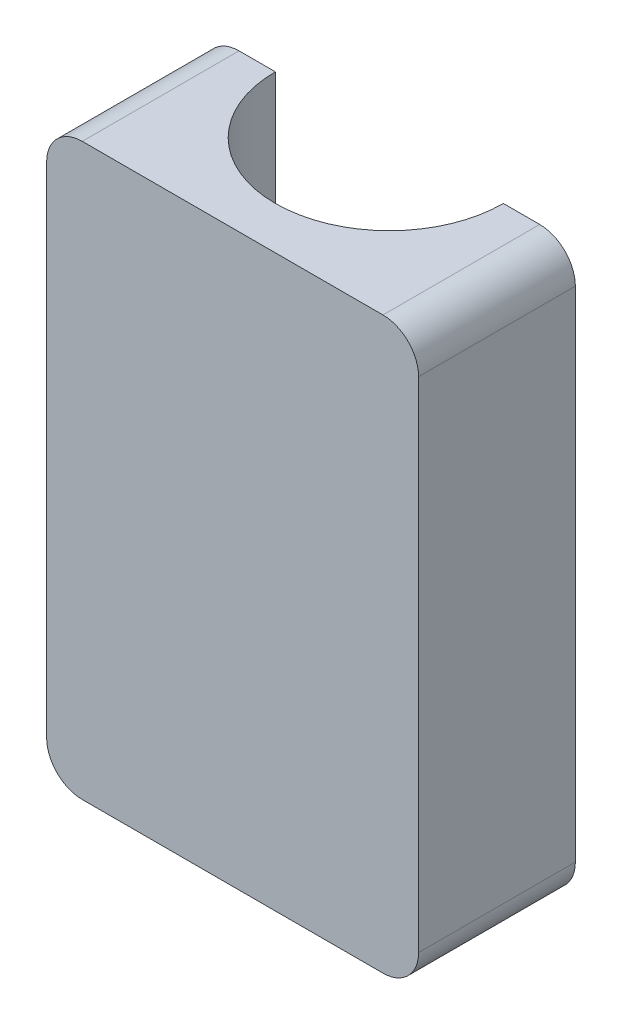
ISO-10303-21;
HEADER;
FILE_DESCRIPTION(('STEP AP214'),'2;1');
FILE_NAME('part.step','',(''),(''),'','','');
FILE_SCHEMA(('AUTOMOTIVE_DESIGN { 1 0 10303 214 1 1 1 1 }'));
ENDSEC;
DATA;
#1=APPLICATION_CONTEXT('core data for automotive mechanical design processes');
#2=APPLICATION_PROTOCOL_DEFINITION('international standard','automotive_design',2000,#1);
#3=PRODUCT_CONTEXT('',#1,'mechanical');
#4=PRODUCT('Part','Part','',(#3));
#5=PRODUCT_RELATED_PRODUCT_CATEGORY('part','',(#4));
#6=PRODUCT_DEFINITION_FORMATION('','',#4);
#7=PRODUCT_DEFINITION_CONTEXT('part definition',#1,'design');
#8=PRODUCT_DEFINITION('design','',#6,#7);
#9=PRODUCT_DEFINITION_SHAPE('','',#8);
#10=(LENGTH_UNIT() NAMED_UNIT(*) SI_UNIT(.MILLI.,.METRE.));
#11=(NAMED_UNIT(*) PLANE_ANGLE_UNIT() SI_UNIT($,.RADIAN.));
#12=(NAMED_UNIT(*) SI_UNIT($,.STERADIAN.) SOLID_ANGLE_UNIT());
#13=UNCERTAINTY_MEASURE_WITH_UNIT(LENGTH_MEASURE(1.E-05),#10,'distance_accuracy_value','');
#14=(GEOMETRIC_REPRESENTATION_CONTEXT(3) GLOBAL_UNCERTAINTY_ASSIGNED_CONTEXT((#13)) GLOBAL_UNIT_ASSIGNED_CONTEXT((#10,
#11,#12)) REPRESENTATION_CONTEXT('',''));
#15=CARTESIAN_POINT('',(0.,0.,0.));
#16=DIRECTION('',(0.,0.,1.));
#17=DIRECTION('',(1.,0.,0.));
#18=AXIS2_PLACEMENT_3D('',#15,#16,#17);
#19=CARTESIAN_POINT('',(0.,0.,0.));
#20=DIRECTION('',(0.,0.,1.));
#21=DIRECTION('',(1.,0.,0.));
#22=AXIS2_PLACEMENT_3D('',#19,#20,#21);
#23=PLANE('',#22);
#24=DIRECTION('',(-1.,0.,0.));
#25=VECTOR('',#24,1.);
#26=CARTESIAN_POINT('',(-41.2247953621848,-2.00646090534981,0.));
#27=LINE('',#26,#25);
#28=CARTESIAN_POINT('',(-31.1247953621848,-2.00646090534981,0.));
#29=VERTEX_POINT('',#28);
#30=CARTESIAN_POINT('',(-36.2247953621848,-2.00646090534981,0.));
#31=VERTEX_POINT('',#30);
#32=EDGE_CURVE('E144',#29,#31,#27,.T.);
#33=ORIENTED_EDGE('',*,*,#32,.F.);
#34=DIRECTION('',(0.,-1.,0.));
#35=VECTOR('',#34,1.);
#36=CARTESIAN_POINT('',(-31.1247953621848,-2.00646090534981,0.));
#37=LINE('',#36,#35);
#38=CARTESIAN_POINT('',(-31.1247953621848,-82.0064609053498,0.));
#39=VERTEX_POINT('',#38);
#40=EDGE_CURVE('E11',#29,#39,#37,.T.);
#41=ORIENTED_EDGE('',*,*,#40,.T.);
#42=DIRECTION('',(1.,0.,0.));
#43=VECTOR('',#42,1.);
#44=CARTESIAN_POINT('',(-41.2247953621848,-82.0064609053498,0.));
#45=LINE('',#44,#43);
#46=CARTESIAN_POINT('',(-36.2247953621848,-82.0064609053498,0.));
#47=VERTEX_POINT('',#46);
#48=EDGE_CURVE('E129',#47,#39,#45,.T.);
#49=ORIENTED_EDGE('',*,*,#48,.F.);
#50=CARTESIAN_POINT('',(-36.2247953621848,-77.0064609053498,0.));
#51=DIRECTION('',(0.,0.,1.));
#52=DIRECTION('',(1.,0.,0.));
#53=AXIS2_PLACEMENT_3D('',#50,#51,#52);
#54=CIRCLE('',#53,5.);
#55=CARTESIAN_POINT('',(-41.2247953621848,-77.0064609053498,0.));
#56=VERTEX_POINT('',#55);
#57=EDGE_CURVE('E159',#47,#56,#54,.F.);
#58=ORIENTED_EDGE('',*,*,#57,.T.);
#59=DIRECTION('',(0.,-1.,0.));
#60=VECTOR('',#59,1.);
#61=CARTESIAN_POINT('',(-41.2247953621848,-2.00646090534981,0.));
#62=LINE('',#61,#60);
#63=CARTESIAN_POINT('',(-41.2247953621848,-7.00646090534981,0.));
#64=VERTEX_POINT('',#63);
#65=EDGE_CURVE('E135',#64,#56,#62,.T.);
#66=ORIENTED_EDGE('',*,*,#65,.F.);
#67=CARTESIAN_POINT('',(-36.2247953621848,-7.00646090534981,0.));
#68=DIRECTION('',(0.,0.,1.));
#69=DIRECTION('',(1.,0.,0.));
#70=AXIS2_PLACEMENT_3D('',#67,#68,#69);
#71=CIRCLE('',#70,5.);
#72=EDGE_CURVE('E153',#64,#31,#71,.F.);
#73=ORIENTED_EDGE('',*,*,#72,.T.);
#74=EDGE_LOOP('',(#33,#41,#49,#58,#66,#73));
#75=FACE_BOUND('',#74,.T.);
#76=ADVANCED_FACE('F39',(#75),#23,.F.);
#77=CARTESIAN_POINT('',(-41.2247953621848,-2.00646090534981,22.));
#78=DIRECTION('',(1.,0.,0.));
#79=DIRECTION('',(0.,0.,-1.));
#80=AXIS2_PLACEMENT_3D('',#77,#78,#79);
#81=PLANE('',#80);
#82=ORIENTED_EDGE('',*,*,#65,.T.);
#83=DIRECTION('',(0.,0.,-1.));
#84=VECTOR('',#83,1.);
#85=CARTESIAN_POINT('',(-41.2247953621848,-77.0064609053498,22.));
#86=LINE('',#85,#84);
#87=CARTESIAN_POINT('',(-41.2247953621848,-77.0064609053498,22.));
#88=VERTEX_POINT('',#87);
#89=EDGE_CURVE('E164',#56,#88,#86,.F.);
#90=ORIENTED_EDGE('',*,*,#89,.T.);
#91=DIRECTION('',(0.,-1.,0.));
#92=VECTOR('',#91,1.);
#93=CARTESIAN_POINT('',(-41.2247953621848,-2.00646090534981,22.));
#94=LINE('',#93,#92);
#95=CARTESIAN_POINT('',(-41.2247953621848,-7.00646090534981,22.));
#96=VERTEX_POINT('',#95);
#97=EDGE_CURVE('E147',#96,#88,#94,.T.);
#98=ORIENTED_EDGE('',*,*,#97,.F.);
#99=DIRECTION('',(0.,0.,-1.));
#100=VECTOR('',#99,1.);
#101=CARTESIAN_POINT('',(-41.2247953621848,-7.00646090534981,22.));
#102=LINE('',#101,#100);
#103=EDGE_CURVE('E161',#96,#64,#102,.T.);
#104=ORIENTED_EDGE('',*,*,#103,.T.);
#105=EDGE_LOOP('',(#82,#90,#98,#104));
#106=FACE_BOUND('',#105,.T.);
#107=ADVANCED_FACE('F212',(#106),#81,.F.);
#108=CARTESIAN_POINT('',(-41.2247953621848,-82.0064609053498,22.));
#109=DIRECTION('',(0.,1.,0.));
#110=DIRECTION('',(0.,0.,1.));
#111=AXIS2_PLACEMENT_3D('',#108,#109,#110);
#112=PLANE('',#111);
#113=ORIENTED_EDGE('',*,*,#48,.T.);
#114=CARTESIAN_POINT('',(-15.1247953621848,-82.0064609053498,0.));
#115=DIRECTION('',(0.,-1.,0.));
#116=DIRECTION('',(0.,0.,-1.));
#117=AXIS2_PLACEMENT_3D('',#114,#115,#116);
#118=CIRCLE('',#117,16.);
#119=CARTESIAN_POINT('',(0.875204637815156,-82.0064609053498,0.));
#120=VERTEX_POINT('',#119);
#121=EDGE_CURVE('E116',#120,#39,#118,.T.);
#122=ORIENTED_EDGE('',*,*,#121,.F.);
#123=CARTESIAN_POINT('',(5.97520463781516,-82.0064609053498,0.));
#124=VERTEX_POINT('',#123);
#125=EDGE_CURVE('E125',#120,#124,#45,.T.);
#126=ORIENTED_EDGE('',*,*,#125,.T.);
#127=DIRECTION('',(0.,0.,-1.));
#128=VECTOR('',#127,1.);
#129=CARTESIAN_POINT('',(5.97520463781516,-82.0064609053498,22.));
#130=LINE('',#129,#128);
#131=CARTESIAN_POINT('',(5.97520463781516,-82.0064609053498,22.));
#132=VERTEX_POINT('',#131);
#133=EDGE_CURVE('E148',#124,#132,#130,.F.);
#134=ORIENTED_EDGE('',*,*,#133,.T.);
#135=DIRECTION('',(1.,0.,0.));
#136=VECTOR('',#135,1.);
#137=CARTESIAN_POINT('',(-41.2247953621848,-82.0064609053498,22.));
#138=LINE('',#137,#136);
#139=CARTESIAN_POINT('',(-36.2247953621848,-82.0064609053498,22.));
#140=VERTEX_POINT('',#139);
#141=EDGE_CURVE('E199',#140,#132,#138,.T.);
#142=ORIENTED_EDGE('',*,*,#141,.F.);
#143=DIRECTION('',(0.,0.,-1.));
#144=VECTOR('',#143,1.);
#145=CARTESIAN_POINT('',(-36.2247953621848,-82.0064609053498,22.));
#146=LINE('',#145,#144);
#147=EDGE_CURVE('E150',#140,#47,#146,.T.);
#148=ORIENTED_EDGE('',*,*,#147,.T.);
#149=EDGE_LOOP('',(#113,#122,#126,#134,#142,#148));
#150=FACE_BOUND('',#149,.T.);
#151=ADVANCED_FACE('F124',(#150),#112,.F.);
#152=CARTESIAN_POINT('',(10.9752046378151,-2.00646090534981,22.));
#153=DIRECTION('',(-1.,0.,0.));
#154=DIRECTION('',(0.,-1.,0.));
#155=AXIS2_PLACEMENT_3D('',#152,#153,#154);
#156=PLANE('',#155);
#157=DIRECTION('',(0.,1.,0.));
#158=VECTOR('',#157,1.);
#159=CARTESIAN_POINT('',(10.9752046378151,-2.00646090534981,22.));
#160=LINE('',#159,#158);
#161=CARTESIAN_POINT('',(10.9752046378152,-77.0064609053498,22.));
#162=VERTEX_POINT('',#161);
#163=CARTESIAN_POINT('',(10.9752046378151,-7.00646090534981,22.));
#164=VERTEX_POINT('',#163);
#165=EDGE_CURVE('E196',#162,#164,#160,.T.);
#166=ORIENTED_EDGE('',*,*,#165,.F.);
#167=DIRECTION('',(0.,0.,-1.));
#168=VECTOR('',#167,1.);
#169=CARTESIAN_POINT('',(10.9752046378152,-77.0064609053498,22.));
#170=LINE('',#169,#168);
#171=CARTESIAN_POINT('',(10.9752046378152,-77.0064609053498,0.));
#172=VERTEX_POINT('',#171);
#173=EDGE_CURVE('E176',#162,#172,#170,.T.);
#174=ORIENTED_EDGE('',*,*,#173,.T.);
#175=DIRECTION('',(0.,1.,0.));
#176=VECTOR('',#175,1.);
#177=CARTESIAN_POINT('',(10.9752046378151,-2.00646090534981,0.));
#178=LINE('',#177,#176);
#179=CARTESIAN_POINT('',(10.9752046378151,-7.00646090534981,0.));
#180=VERTEX_POINT('',#179);
#181=EDGE_CURVE('E137',#172,#180,#178,.T.);
#182=ORIENTED_EDGE('',*,*,#181,.T.);
#183=DIRECTION('',(0.,0.,-1.));
#184=VECTOR('',#183,1.);
#185=CARTESIAN_POINT('',(10.9752046378151,-7.00646090534981,22.));
#186=LINE('',#185,#184);
#187=EDGE_CURVE('E174',#180,#164,#186,.F.);
#188=ORIENTED_EDGE('',*,*,#187,.T.);
#189=EDGE_LOOP('',(#166,#174,#182,#188));
#190=FACE_BOUND('',#189,.T.);
#191=ADVANCED_FACE('F188',(#190),#156,.F.);
#192=CARTESIAN_POINT('',(-41.2247953621848,-2.00646090534981,22.));
#193=DIRECTION('',(0.,-1.,0.));
#194=DIRECTION('',(0.,0.,-1.));
#195=AXIS2_PLACEMENT_3D('',#192,#193,#194);
#196=PLANE('',#195);
#197=CARTESIAN_POINT('',(5.97520463781515,-2.00646090534981,0.));
#198=VERTEX_POINT('',#197);
#199=CARTESIAN_POINT('',(0.875204637815152,-2.00646090534981,0.));
#200=VERTEX_POINT('',#199);
#201=EDGE_CURVE('E145',#198,#200,#27,.T.);
#202=ORIENTED_EDGE('',*,*,#201,.T.);
#203=CARTESIAN_POINT('',(-15.1247953621848,-2.00646090534981,0.));
#204=DIRECTION('',(0.,-1.,0.));
#205=DIRECTION('',(0.,0.,-1.));
#206=AXIS2_PLACEMENT_3D('',#203,#204,#205);
#207=CIRCLE('',#206,16.);
#208=EDGE_CURVE('E54',#200,#29,#207,.T.);
#209=ORIENTED_EDGE('',*,*,#208,.T.);
#210=ORIENTED_EDGE('',*,*,#32,.T.);
#211=DIRECTION('',(0.,0.,-1.));
#212=VECTOR('',#211,1.);
#213=CARTESIAN_POINT('',(-36.2247953621848,-2.00646090534981,22.));
#214=LINE('',#213,#212);
#215=CARTESIAN_POINT('',(-36.2247953621848,-2.00646090534981,22.));
#216=VERTEX_POINT('',#215);
#217=EDGE_CURVE('E62',#31,#216,#214,.F.);
#218=ORIENTED_EDGE('',*,*,#217,.T.);
#219=DIRECTION('',(-1.,0.,0.));
#220=VECTOR('',#219,1.);
#221=CARTESIAN_POINT('',(-41.2247953621848,-2.00646090534981,22.));
#222=LINE('',#221,#220);
#223=CARTESIAN_POINT('',(5.97520463781515,-2.00646090534981,22.));
#224=VERTEX_POINT('',#223);
#225=EDGE_CURVE('E151',#224,#216,#222,.T.);
#226=ORIENTED_EDGE('',*,*,#225,.F.);
#227=DIRECTION('',(0.,0.,-1.));
#228=VECTOR('',#227,1.);
#229=CARTESIAN_POINT('',(5.97520463781515,-2.00646090534981,22.));
#230=LINE('',#229,#228);
#231=EDGE_CURVE('E121',#224,#198,#230,.T.);
#232=ORIENTED_EDGE('',*,*,#231,.T.);
#233=EDGE_LOOP('',(#202,#209,#210,#218,#226,#232));
#234=FACE_BOUND('',#233,.T.);
#235=ADVANCED_FACE('F182',(#234),#196,.F.);
#236=CARTESIAN_POINT('',(0.,0.,22.));
#237=DIRECTION('',(0.,0.,1.));
#238=DIRECTION('',(1.,0.,0.));
#239=AXIS2_PLACEMENT_3D('',#236,#237,#238);
#240=PLANE('',#239);
#241=ORIENTED_EDGE('',*,*,#97,.T.);
#242=CARTESIAN_POINT('',(-36.2247953621848,-77.0064609053498,22.));
#243=DIRECTION('',(0.,0.,1.));
#244=DIRECTION('',(1.,0.,0.));
#245=AXIS2_PLACEMENT_3D('',#242,#243,#244);
#246=CIRCLE('',#245,5.);
#247=EDGE_CURVE('E172',#88,#140,#246,.T.);
#248=ORIENTED_EDGE('',*,*,#247,.T.);
#249=ORIENTED_EDGE('',*,*,#141,.T.);
#250=CARTESIAN_POINT('',(5.97520463781516,-77.0064609053498,22.));
#251=DIRECTION('',(0.,0.,1.));
#252=DIRECTION('',(1.,0.,0.));
#253=AXIS2_PLACEMENT_3D('',#250,#251,#252);
#254=CIRCLE('',#253,5.);
#255=EDGE_CURVE('E170',#132,#162,#254,.T.);
#256=ORIENTED_EDGE('',*,*,#255,.T.);
#257=ORIENTED_EDGE('',*,*,#165,.T.);
#258=CARTESIAN_POINT('',(5.97520463781515,-7.00646090534981,22.));
#259=DIRECTION('',(0.,0.,1.));
#260=DIRECTION('',(1.,0.,0.));
#261=AXIS2_PLACEMENT_3D('',#258,#259,#260);
#262=CIRCLE('',#261,5.);
#263=EDGE_CURVE('E168',#164,#224,#262,.T.);
#264=ORIENTED_EDGE('',*,*,#263,.T.);
#265=ORIENTED_EDGE('',*,*,#225,.T.);
#266=CARTESIAN_POINT('',(-36.2247953621848,-7.00646090534981,22.));
#267=DIRECTION('',(0.,0.,1.));
#268=DIRECTION('',(1.,0.,0.));
#269=AXIS2_PLACEMENT_3D('',#266,#267,#268);
#270=CIRCLE('',#269,5.);
#271=EDGE_CURVE('E166',#216,#96,#270,.T.);
#272=ORIENTED_EDGE('',*,*,#271,.T.);
#273=EDGE_LOOP('',(#241,#248,#249,#256,#257,#264,#265,#272));
#274=FACE_BOUND('',#273,.T.);
#275=ADVANCED_FACE('F194',(#274),#240,.T.);
#276=ORIENTED_EDGE('',*,*,#125,.F.);
#277=DIRECTION('',(0.,-1.,0.));
#278=VECTOR('',#277,1.);
#279=CARTESIAN_POINT('',(0.875204637815156,-2.00646090534981,0.));
#280=LINE('',#279,#278);
#281=EDGE_CURVE('E47',#120,#200,#280,.F.);
#282=ORIENTED_EDGE('',*,*,#281,.T.);
#283=ORIENTED_EDGE('',*,*,#201,.F.);
#284=CARTESIAN_POINT('',(5.97520463781515,-7.00646090534981,0.));
#285=DIRECTION('',(0.,0.,1.));
#286=DIRECTION('',(1.,0.,0.));
#287=AXIS2_PLACEMENT_3D('',#284,#285,#286);
#288=CIRCLE('',#287,5.);
#289=EDGE_CURVE('E156',#198,#180,#288,.F.);
#290=ORIENTED_EDGE('',*,*,#289,.T.);
#291=ORIENTED_EDGE('',*,*,#181,.F.);
#292=CARTESIAN_POINT('',(5.97520463781516,-77.0064609053498,0.));
#293=DIRECTION('',(0.,0.,1.));
#294=DIRECTION('',(1.,0.,0.));
#295=AXIS2_PLACEMENT_3D('',#292,#293,#294);
#296=CIRCLE('',#295,5.);
#297=EDGE_CURVE('E133',#172,#124,#296,.F.);
#298=ORIENTED_EDGE('',*,*,#297,.T.);
#299=EDGE_LOOP('',(#276,#282,#283,#290,#291,#298));
#300=FACE_BOUND('',#299,.T.);
#301=ADVANCED_FACE('F131',(#300),#23,.F.);
#302=CARTESIAN_POINT('',(-36.2247953621848,-77.0064609053498,22.));
#303=DIRECTION('',(0.,0.,-1.));
#304=DIRECTION('',(-1.,0.,0.));
#305=AXIS2_PLACEMENT_3D('',#302,#303,#304);
#306=CYLINDRICAL_SURFACE('',#305,5.);
#307=ORIENTED_EDGE('',*,*,#247,.F.);
#308=ORIENTED_EDGE('',*,*,#89,.F.);
#309=ORIENTED_EDGE('',*,*,#57,.F.);
#310=ORIENTED_EDGE('',*,*,#147,.F.);
#311=EDGE_LOOP('',(#307,#308,#309,#310));
#312=FACE_BOUND('',#311,.T.);
#313=ADVANCED_FACE('F215',(#312),#306,.T.);
#314=CARTESIAN_POINT('',(5.97520463781516,-77.0064609053498,22.));
#315=DIRECTION('',(0.,0.,-1.));
#316=DIRECTION('',(-1.,0.,0.));
#317=AXIS2_PLACEMENT_3D('',#314,#315,#316);
#318=CYLINDRICAL_SURFACE('',#317,5.);
#319=ORIENTED_EDGE('',*,*,#255,.F.);
#320=ORIENTED_EDGE('',*,*,#133,.F.);
#321=ORIENTED_EDGE('',*,*,#297,.F.);
#322=ORIENTED_EDGE('',*,*,#173,.F.);
#323=EDGE_LOOP('',(#319,#320,#321,#322));
#324=FACE_BOUND('',#323,.T.);
#325=ADVANCED_FACE('F219',(#324),#318,.T.);
#326=CARTESIAN_POINT('',(5.97520463781515,-7.00646090534981,22.));
#327=DIRECTION('',(0.,0.,-1.));
#328=DIRECTION('',(-1.,0.,0.));
#329=AXIS2_PLACEMENT_3D('',#326,#327,#328);
#330=CYLINDRICAL_SURFACE('',#329,5.);
#331=ORIENTED_EDGE('',*,*,#263,.F.);
#332=ORIENTED_EDGE('',*,*,#187,.F.);
#333=ORIENTED_EDGE('',*,*,#289,.F.);
#334=ORIENTED_EDGE('',*,*,#231,.F.);
#335=EDGE_LOOP('',(#331,#332,#333,#334));
#336=FACE_BOUND('',#335,.T.);
#337=ADVANCED_FACE('F191',(#336),#330,.T.);
#338=CARTESIAN_POINT('',(-36.2247953621848,-7.00646090534981,22.));
#339=DIRECTION('',(0.,0.,-1.));
#340=DIRECTION('',(-1.,0.,0.));
#341=AXIS2_PLACEMENT_3D('',#338,#339,#340);
#342=CYLINDRICAL_SURFACE('',#341,5.);
#343=ORIENTED_EDGE('',*,*,#271,.F.);
#344=ORIENTED_EDGE('',*,*,#217,.F.);
#345=ORIENTED_EDGE('',*,*,#72,.F.);
#346=ORIENTED_EDGE('',*,*,#103,.F.);
#347=EDGE_LOOP('',(#343,#344,#345,#346));
#348=FACE_BOUND('',#347,.T.);
#349=ADVANCED_FACE('F41',(#348),#342,.T.);
#350=CARTESIAN_POINT('',(-15.1247953621848,-2.00646090534981,0.));
#351=DIRECTION('',(0.,-1.,0.));
#352=DIRECTION('',(0.,0.,-1.));
#353=AXIS2_PLACEMENT_3D('',#350,#351,#352);
#354=CYLINDRICAL_SURFACE('',#353,16.);
#355=ORIENTED_EDGE('',*,*,#208,.F.);
#356=ORIENTED_EDGE('',*,*,#281,.F.);
#357=ORIENTED_EDGE('',*,*,#121,.T.);
#358=ORIENTED_EDGE('',*,*,#40,.F.);
#359=EDGE_LOOP('',(#355,#356,#357,#358));
#360=FACE_BOUND('',#359,.T.);
#361=ADVANCED_FACE('F115',(#360),#354,.F.);
#362=CLOSED_SHELL('',(#76,#107,#151,#191,#235,#275,#301,#313,#325,#337,#349,#361));
#363=MANIFOLD_SOLID_BREP('B2',#362);
#364=ADVANCED_BREP_SHAPE_REPRESENTATION('',(#18,#363),#14);
#365=SHAPE_DEFINITION_REPRESENTATION(#9,#364);
ENDSEC;
END-ISO-10303-21;
